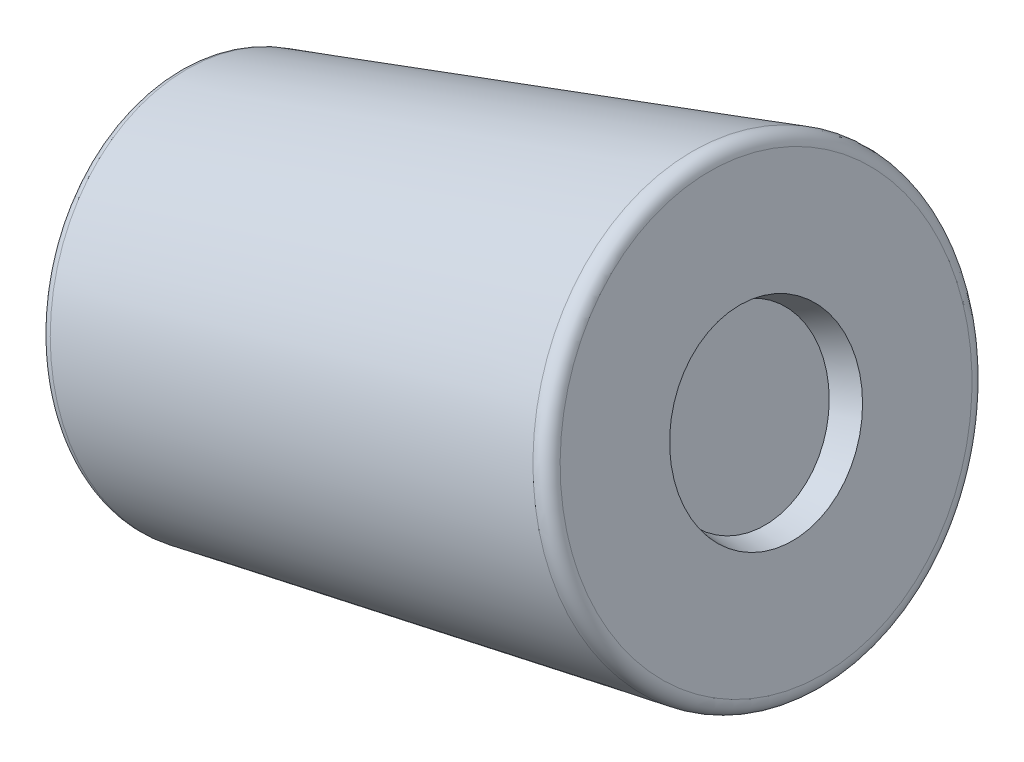
ISO-10303-21;
HEADER;
FILE_DESCRIPTION(('STEP AP214'),'2;1');
FILE_NAME('part.step','',(''),(''),'','','');
FILE_SCHEMA(('AUTOMOTIVE_DESIGN { 1 0 10303 214 1 1 1 1 }'));
ENDSEC;
DATA;
#1=APPLICATION_CONTEXT('core data for automotive mechanical design processes');
#2=APPLICATION_PROTOCOL_DEFINITION('international standard','automotive_design',2000,#1);
#3=PRODUCT_CONTEXT('',#1,'mechanical');
#4=PRODUCT('Part','Part','',(#3));
#5=PRODUCT_RELATED_PRODUCT_CATEGORY('part','',(#4));
#6=PRODUCT_DEFINITION_FORMATION('','',#4);
#7=PRODUCT_DEFINITION_CONTEXT('part definition',#1,'design');
#8=PRODUCT_DEFINITION('design','',#6,#7);
#9=PRODUCT_DEFINITION_SHAPE('','',#8);
#10=(LENGTH_UNIT() NAMED_UNIT(*) SI_UNIT(.MILLI.,.METRE.));
#11=(NAMED_UNIT(*) PLANE_ANGLE_UNIT() SI_UNIT($,.RADIAN.));
#12=(NAMED_UNIT(*) SI_UNIT($,.STERADIAN.) SOLID_ANGLE_UNIT());
#13=UNCERTAINTY_MEASURE_WITH_UNIT(LENGTH_MEASURE(1.E-05),#10,'distance_accuracy_value','');
#14=(GEOMETRIC_REPRESENTATION_CONTEXT(3) GLOBAL_UNCERTAINTY_ASSIGNED_CONTEXT((#13)) GLOBAL_UNIT_ASSIGNED_CONTEXT((#10,
#11,#12)) REPRESENTATION_CONTEXT('',''));
#15=CARTESIAN_POINT('',(0.,0.,0.));
#16=DIRECTION('',(0.,0.,1.));
#17=DIRECTION('',(1.,0.,0.));
#18=AXIS2_PLACEMENT_3D('',#15,#16,#17);
#19=CARTESIAN_POINT('',(-2.76495829742924,16.0924141587077,0.));
#20=DIRECTION('',(-0.958740541858694,-0.284282559078988,0.));
#21=DIRECTION('',(0.284282559078988,-0.958740541858694,0.));
#22=AXIS2_PLACEMENT_3D('',#19,#20,#21);
#23=PLANE('',#22);
#24=CARTESIAN_POINT('',(-3.90208853374519,19.9273763261425,0.));
#25=DIRECTION('',(-0.958740541858694,-0.284282559078988,0.));
#26=DIRECTION('',(0.284282559078988,-0.958740541858694,0.));
#27=AXIS2_PLACEMENT_3D('',#24,#25,#26);
#28=CIRCLE('',#27,3.7353273671202);
#29=CARTESIAN_POINT('',(-2.84020011082248,16.34616654217,0.));
#30=VERTEX_POINT('',#29);
#31=EDGE_CURVE('E11',#30,#30,#28,.F.);
#32=ORIENTED_EDGE('',*,*,#31,.T.);
#33=EDGE_LOOP('',(#32));
#34=FACE_BOUND('',#33,.T.);
#35=CARTESIAN_POINT('',(-3.90208853374518,19.9273763261425,0.));
#36=DIRECTION('',(0.958740541858694,0.284282559078988,0.));
#37=DIRECTION('',(-0.284282559078988,0.958740541858694,0.));
#38=AXIS2_PLACEMENT_3D('',#35,#36,#37);
#39=CIRCLE('',#38,1.75);
#40=CARTESIAN_POINT('',(-4.39958301213341,21.6051722743952,0.));
#41=VERTEX_POINT('',#40);
#42=EDGE_CURVE('E80',#41,#41,#39,.T.);
#43=ORIENTED_EDGE('',*,*,#42,.F.);
#44=EDGE_LOOP('',(#43));
#45=FACE_BOUND('',#44,.T.);
#46=ADVANCED_FACE('F33',(#34,#45),#23,.F.);
#47=CARTESIAN_POINT('',(-13.9110321599216,16.9595576270287,0.));
#48=DIRECTION('',(-0.958740541858694,-0.284282559078988,0.));
#49=DIRECTION('',(0.284282559078988,-0.958740541858694,0.));
#50=AXIS2_PLACEMENT_3D('',#47,#48,#49);
#51=CONICAL_SURFACE('',#50,0.,1.51379442365533);
#52=CARTESIAN_POINT('',(-14.0830179568809,16.9085609701124,0.));
#53=DIRECTION('',(0.958740541858694,0.284282559078988,0.));
#54=DIRECTION('',(-0.284282559078988,0.958740541858694,0.));
#55=AXIS2_PLACEMENT_3D('',#52,#53,#54);
#56=CIRCLE('',#55,3.14362986153475);
#57=CARTESIAN_POINT('',(-14.9766970987151,19.9224863669634,0.));
#58=VERTEX_POINT('',#57);
#59=EDGE_CURVE('E39',#58,#58,#56,.F.);
#60=ORIENTED_EDGE('',*,*,#59,.T.);
#61=EDGE_LOOP('',(#60));
#62=FACE_BOUND('',#61,.T.);
#63=CARTESIAN_POINT('',(-13.9110321599216,16.9595576270287,0.));
#64=VERTEX_POINT('',#63);
#65=VERTEX_LOOP('',#64);
#66=FACE_BOUND('',#65,.T.);
#67=ADVANCED_FACE('F42',(#62,#66),#51,.F.);
#68=CARTESIAN_POINT('',(-14.096673068216,16.9045120018824,0.));
#69=DIRECTION('',(0.958740541858694,0.284282559078988,0.));
#70=DIRECTION('',(-0.284282559078988,0.958740541858694,0.));
#71=AXIS2_PLACEMENT_3D('',#68,#69,#70);
#72=CONICAL_SURFACE('',#71,3.39322381937567,0.0570019031395662);
#73=CARTESIAN_POINT('',(-13.8573772218309,16.9754672109481,0.));
#74=DIRECTION('',(-0.958740541858694,-0.284282559078988,0.));
#75=DIRECTION('',(0.284282559078988,-0.958740541858694,0.));
#76=AXIS2_PLACEMENT_3D('',#73,#74,#75);
#77=CIRCLE('',#76,3.40746657926627);
#78=CARTESIAN_POINT('',(-12.888693902701,13.7085908563769,0.));
#79=VERTEX_POINT('',#78);
#80=EDGE_CURVE('E88',#79,#79,#77,.F.);
#81=ORIENTED_EDGE('',*,*,#80,.T.);
#82=EDGE_LOOP('',(#81));
#83=FACE_BOUND('',#82,.T.);
#84=CARTESIAN_POINT('',(-4.15542878054492,19.8522567181427,0.));
#85=DIRECTION('',(-0.958740541858694,-0.284282559078988,0.));
#86=DIRECTION('',(0.284282559078988,-0.958740541858694,0.));
#87=AXIS2_PLACEMENT_3D('',#84,#85,#86);
#88=CIRCLE('',#87,3.98492132496113);
#89=CARTESIAN_POINT('',(-3.02258514855654,16.0317510877852,0.));
#90=VERTEX_POINT('',#89);
#91=EDGE_CURVE('E75',#90,#90,#88,.T.);
#92=ORIENTED_EDGE('',*,*,#91,.T.);
#93=EDGE_LOOP('',(#92));
#94=FACE_BOUND('',#93,.T.);
#95=ADVANCED_FACE('F44',(#83,#94),#72,.T.);
#96=CARTESIAN_POINT('',(-3.90208853374518,19.9273763261425,0.));
#97=DIRECTION('',(0.958740541858694,0.284282559078988,0.));
#98=DIRECTION('',(-0.284282559078988,0.958740541858694,0.));
#99=AXIS2_PLACEMENT_3D('',#96,#97,#98);
#100=CONICAL_SURFACE('',#99,1.75,0.279252680319093);
#101=CARTESIAN_POINT('',(-4.38145880467453,19.785235046603,0.));
#102=DIRECTION('',(0.958740541858694,0.284282559078988,0.));
#103=DIRECTION('',(-0.284282559078988,0.958740541858694,0.));
#104=AXIS2_PLACEMENT_3D('',#101,#102,#103);
#105=CIRCLE('',#104,1.6066273071206);
#106=CARTESIAN_POINT('',(-4.83819492702896,21.3255737815968,0.));
#107=VERTEX_POINT('',#106);
#108=EDGE_CURVE('E82',#107,#107,#105,.T.);
#109=ORIENTED_EDGE('',*,*,#108,.F.);
#110=EDGE_LOOP('',(#109));
#111=FACE_BOUND('',#110,.T.);
#112=ORIENTED_EDGE('',*,*,#42,.T.);
#113=EDGE_LOOP('',(#112));
#114=FACE_BOUND('',#113,.T.);
#115=ADVANCED_FACE('F50',(#111,#114),#100,.F.);
#116=CARTESIAN_POINT('',(-4.38145880467453,19.785235046603,0.));
#117=DIRECTION('',(0.958740541858694,0.284282559078988,0.));
#118=DIRECTION('',(-0.284282559078988,0.958740541858694,0.));
#119=AXIS2_PLACEMENT_3D('',#116,#117,#118);
#120=PLANE('',#119);
#121=ORIENTED_EDGE('',*,*,#108,.T.);
#122=EDGE_LOOP('',(#121));
#123=FACE_BOUND('',#122,.T.);
#124=ADVANCED_FACE('F58',(#123),#120,.T.);
#125=CARTESIAN_POINT('',(-13.8437221104958,16.9795161791781,0.));
#126=DIRECTION('',(-0.958740541858694,-0.284282559078988,0.));
#127=DIRECTION('',(0.284282559078988,-0.958740541858694,0.));
#128=AXIS2_PLACEMENT_3D('',#125,#126,#127);
#129=TOROIDAL_SURFACE('',#128,3.15787262142534,0.25);
#130=ORIENTED_EDGE('',*,*,#59,.F.);
#131=EDGE_LOOP('',(#130));
#132=FACE_BOUND('',#131,.T.);
#133=ORIENTED_EDGE('',*,*,#80,.F.);
#134=EDGE_LOOP('',(#133));
#135=FACE_BOUND('',#134,.T.);
#136=ADVANCED_FACE('F62',(#132,#135),#129,.T.);
#137=CARTESIAN_POINT('',(-4.14177366920986,19.8563056863727,0.));
#138=DIRECTION('',(-0.958740541858694,-0.284282559078988,0.));
#139=DIRECTION('',(0.284282559078988,-0.958740541858694,0.));
#140=AXIS2_PLACEMENT_3D('',#137,#138,#139);
#141=TOROIDAL_SURFACE('',#140,3.7353273671202,0.25);
#142=ORIENTED_EDGE('',*,*,#91,.F.);
#143=EDGE_LOOP('',(#142));
#144=FACE_BOUND('',#143,.T.);
#145=ORIENTED_EDGE('',*,*,#31,.F.);
#146=EDGE_LOOP('',(#145));
#147=FACE_BOUND('',#146,.T.);
#148=ADVANCED_FACE('F66',(#144,#147),#141,.T.);
#149=CLOSED_SHELL('',(#46,#67,#95,#115,#124,#136,#148));
#150=MANIFOLD_SOLID_BREP('B2',#149);
#151=ADVANCED_BREP_SHAPE_REPRESENTATION('',(#18,#150),#14);
#152=SHAPE_DEFINITION_REPRESENTATION(#9,#151);
ENDSEC;
END-ISO-10303-21;
